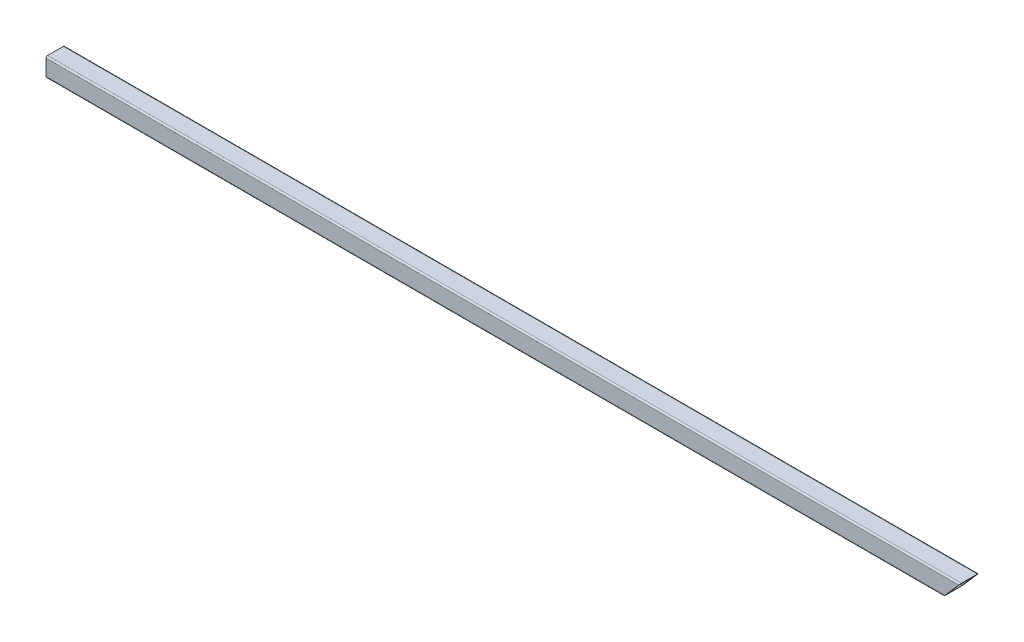
ISO-10303-21;
HEADER;
FILE_DESCRIPTION(('STEP AP214'),'2;1');
FILE_NAME('part.step','',(''),(''),'','','');
FILE_SCHEMA(('AUTOMOTIVE_DESIGN { 1 0 10303 214 1 1 1 1 }'));
ENDSEC;
DATA;
#1=APPLICATION_CONTEXT('core data for automotive mechanical design processes');
#2=APPLICATION_PROTOCOL_DEFINITION('international standard','automotive_design',2000,#1);
#3=PRODUCT_CONTEXT('',#1,'mechanical');
#4=PRODUCT('Part','Part','',(#3));
#5=PRODUCT_RELATED_PRODUCT_CATEGORY('part','',(#4));
#6=PRODUCT_DEFINITION_FORMATION('','',#4);
#7=PRODUCT_DEFINITION_CONTEXT('part definition',#1,'design');
#8=PRODUCT_DEFINITION('design','',#6,#7);
#9=PRODUCT_DEFINITION_SHAPE('','',#8);
#10=(LENGTH_UNIT() NAMED_UNIT(*) SI_UNIT(.MILLI.,.METRE.));
#11=(NAMED_UNIT(*) PLANE_ANGLE_UNIT() SI_UNIT($,.RADIAN.));
#12=(NAMED_UNIT(*) SI_UNIT($,.STERADIAN.) SOLID_ANGLE_UNIT());
#13=UNCERTAINTY_MEASURE_WITH_UNIT(LENGTH_MEASURE(1.E-05),#10,'distance_accuracy_value','');
#14=(GEOMETRIC_REPRESENTATION_CONTEXT(3) GLOBAL_UNCERTAINTY_ASSIGNED_CONTEXT((#13)) GLOBAL_UNIT_ASSIGNED_CONTEXT((#10,
#11,#12)) REPRESENTATION_CONTEXT('',''));
#15=CARTESIAN_POINT('',(0.,0.,0.));
#16=DIRECTION('',(0.,0.,1.));
#17=DIRECTION('',(1.,0.,0.));
#18=AXIS2_PLACEMENT_3D('',#15,#16,#17);
#19=CARTESIAN_POINT('',(1320.8,21.209,22.225));
#20=DIRECTION('',(0.,0.,-1.));
#21=DIRECTION('',(0.,1.,0.));
#22=AXIS2_PLACEMENT_3D('',#19,#20,#21);
#23=PLANE('',#22);
#24=DIRECTION('',(-1.,0.,0.));
#25=VECTOR('',#24,1.);
#26=CARTESIAN_POINT('',(1320.8,10.541,22.225));
#27=LINE('',#26,#25);
#28=CARTESIAN_POINT('',(606.359550915697,10.5410000000001,22.225));
#29=VERTEX_POINT('',#28);
#30=CARTESIAN_POINT('',(0.,10.541,22.225));
#31=VERTEX_POINT('',#30);
#32=EDGE_CURVE('E142',#29,#31,#27,.T.);
#33=ORIENTED_EDGE('',*,*,#32,.F.);
#34=DIRECTION('',(-0.65588614843026,-0.754859828244502,0.));
#35=VECTOR('',#34,1.);
#36=CARTESIAN_POINT('',(616.511599642519,22.225,22.225));
#37=LINE('',#36,#35);
#38=CARTESIAN_POINT('',(615.628812796709,21.2089999999999,22.225));
#39=VERTEX_POINT('',#38);
#40=EDGE_CURVE('E128',#39,#29,#37,.T.);
#41=ORIENTED_EDGE('',*,*,#40,.F.);
#42=DIRECTION('',(-1.,0.,0.));
#43=VECTOR('',#42,1.);
#44=CARTESIAN_POINT('',(1320.8,21.209,22.225));
#45=LINE('',#44,#43);
#46=CARTESIAN_POINT('',(0.,21.209,22.225));
#47=VERTEX_POINT('',#46);
#48=EDGE_CURVE('E150',#39,#47,#45,.T.);
#49=ORIENTED_EDGE('',*,*,#48,.T.);
#50=DIRECTION('',(0.,-1.,0.));
#51=VECTOR('',#50,1.);
#52=CARTESIAN_POINT('',(0.,21.209,22.225));
#53=LINE('',#52,#51);
#54=EDGE_CURVE('E148',#47,#31,#53,.T.);
#55=ORIENTED_EDGE('',*,*,#54,.T.);
#56=EDGE_LOOP('',(#33,#41,#49,#55));
#57=FACE_BOUND('',#56,.T.);
#58=ADVANCED_FACE('F43',(#57),#23,.F.);
#59=CARTESIAN_POINT('',(1320.8,21.209,21.209));
#60=DIRECTION('',(-1.,0.,0.));
#61=DIRECTION('',(0.,0.,1.));
#62=AXIS2_PLACEMENT_3D('',#59,#60,#61);
#63=CYLINDRICAL_SURFACE('',#62,1.016);
#64=ORIENTED_EDGE('',*,*,#48,.F.);
#65=CARTESIAN_POINT('',(615.628812796709,21.209,21.209));
#66=DIRECTION('',(-0.754859828244502,0.655886148430259,0.));
#67=DIRECTION('',(-0.655886148430259,-0.754859828244502,0.));
#68=AXIS2_PLACEMENT_3D('',#65,#66,#67);
#69=ELLIPSE('',#68,1.34594524968007,1.016);
#70=CARTESIAN_POINT('',(616.51159964252,22.225,21.209));
#71=VERTEX_POINT('',#70);
#72=EDGE_CURVE('E58',#39,#71,#69,.T.);
#73=ORIENTED_EDGE('',*,*,#72,.T.);
#74=DIRECTION('',(-1.,0.,0.));
#75=VECTOR('',#74,1.);
#76=CARTESIAN_POINT('',(1320.8,22.225,21.209));
#77=LINE('',#76,#75);
#78=CARTESIAN_POINT('',(0.,22.225,21.209));
#79=VERTEX_POINT('',#78);
#80=EDGE_CURVE('E152',#71,#79,#77,.T.);
#81=ORIENTED_EDGE('',*,*,#80,.T.);
#82=CARTESIAN_POINT('',(0.,21.209,21.209));
#83=DIRECTION('',(1.,0.,0.));
#84=DIRECTION('',(0.,0.,-1.));
#85=AXIS2_PLACEMENT_3D('',#82,#83,#84);
#86=CIRCLE('',#85,1.016);
#87=EDGE_CURVE('E154',#79,#47,#86,.T.);
#88=ORIENTED_EDGE('',*,*,#87,.T.);
#89=EDGE_LOOP('',(#64,#73,#81,#88));
#90=FACE_BOUND('',#89,.T.);
#91=ADVANCED_FACE('F261',(#90),#63,.T.);
#92=CARTESIAN_POINT('',(1320.8,22.225,10.541));
#93=DIRECTION('',(0.,-1.,0.));
#94=DIRECTION('',(0.,0.,-1.));
#95=AXIS2_PLACEMENT_3D('',#92,#93,#94);
#96=PLANE('',#95);
#97=ORIENTED_EDGE('',*,*,#80,.F.);
#98=DIRECTION('',(0.,0.,1.));
#99=VECTOR('',#98,1.);
#100=CARTESIAN_POINT('',(616.511599642519,22.225,9.525));
#101=LINE('',#100,#99);
#102=CARTESIAN_POINT('',(616.511599642519,22.225,10.541));
#103=VERTEX_POINT('',#102);
#104=EDGE_CURVE('E241',#103,#71,#101,.T.);
#105=ORIENTED_EDGE('',*,*,#104,.F.);
#106=DIRECTION('',(-1.,0.,0.));
#107=VECTOR('',#106,1.);
#108=CARTESIAN_POINT('',(1320.8,22.225,10.541));
#109=LINE('',#108,#107);
#110=CARTESIAN_POINT('',(0.,22.225,10.541));
#111=VERTEX_POINT('',#110);
#112=EDGE_CURVE('E195',#103,#111,#109,.T.);
#113=ORIENTED_EDGE('',*,*,#112,.T.);
#114=DIRECTION('',(0.,0.,1.));
#115=VECTOR('',#114,1.);
#116=CARTESIAN_POINT('',(0.,22.225,10.541));
#117=LINE('',#116,#115);
#118=EDGE_CURVE('E161',#111,#79,#117,.T.);
#119=ORIENTED_EDGE('',*,*,#118,.T.);
#120=EDGE_LOOP('',(#97,#105,#113,#119));
#121=FACE_BOUND('',#120,.T.);
#122=ADVANCED_FACE('F259',(#121),#96,.F.);
#123=CARTESIAN_POINT('',(1320.8,21.209,10.541));
#124=DIRECTION('',(-1.,0.,0.));
#125=DIRECTION('',(0.,0.,1.));
#126=AXIS2_PLACEMENT_3D('',#123,#124,#125);
#127=CYLINDRICAL_SURFACE('',#126,1.016);
#128=ORIENTED_EDGE('',*,*,#112,.F.);
#129=CARTESIAN_POINT('',(615.628812796709,21.209,10.541));
#130=DIRECTION('',(-0.754859828244502,0.655886148430259,0.));
#131=DIRECTION('',(-0.655886148430259,-0.754859828244502,0.));
#132=AXIS2_PLACEMENT_3D('',#129,#130,#131);
#133=ELLIPSE('',#132,1.34594524968007,1.016);
#134=CARTESIAN_POINT('',(615.628812796709,21.209,9.525));
#135=VERTEX_POINT('',#134);
#136=EDGE_CURVE('E229',#103,#135,#133,.T.);
#137=ORIENTED_EDGE('',*,*,#136,.T.);
#138=DIRECTION('',(-1.,0.,0.));
#139=VECTOR('',#138,1.);
#140=CARTESIAN_POINT('',(1320.8,21.209,9.525));
#141=LINE('',#140,#139);
#142=CARTESIAN_POINT('',(0.,21.209,9.525));
#143=VERTEX_POINT('',#142);
#144=EDGE_CURVE('E193',#135,#143,#141,.T.);
#145=ORIENTED_EDGE('',*,*,#144,.T.);
#146=CARTESIAN_POINT('',(0.,21.209,10.541));
#147=DIRECTION('',(1.,0.,0.));
#148=DIRECTION('',(0.,0.,-1.));
#149=AXIS2_PLACEMENT_3D('',#146,#147,#148);
#150=CIRCLE('',#149,1.016);
#151=EDGE_CURVE('E164',#143,#111,#150,.T.);
#152=ORIENTED_EDGE('',*,*,#151,.T.);
#153=EDGE_LOOP('',(#128,#137,#145,#152));
#154=FACE_BOUND('',#153,.T.);
#155=ADVANCED_FACE('F255',(#154),#127,.T.);
#156=CARTESIAN_POINT('',(1320.8,10.541,9.525));
#157=DIRECTION('',(0.,0.,1.));
#158=DIRECTION('',(1.,0.,0.));
#159=AXIS2_PLACEMENT_3D('',#156,#157,#158);
#160=PLANE('',#159);
#161=ORIENTED_EDGE('',*,*,#144,.F.);
#162=DIRECTION('',(-0.65588614843026,-0.754859828244502,0.));
#163=VECTOR('',#162,1.);
#164=CARTESIAN_POINT('',(616.511599642519,22.225,9.525));
#165=LINE('',#164,#163);
#166=CARTESIAN_POINT('',(606.359550915697,10.541,9.525));
#167=VERTEX_POINT('',#166);
#168=EDGE_CURVE('E136',#135,#167,#165,.T.);
#169=ORIENTED_EDGE('',*,*,#168,.T.);
#170=DIRECTION('',(-1.,0.,0.));
#171=VECTOR('',#170,1.);
#172=CARTESIAN_POINT('',(1320.8,10.541,9.525));
#173=LINE('',#172,#171);
#174=CARTESIAN_POINT('',(0.,10.541,9.525));
#175=VERTEX_POINT('',#174);
#176=EDGE_CURVE('E191',#167,#175,#173,.T.);
#177=ORIENTED_EDGE('',*,*,#176,.T.);
#178=DIRECTION('',(0.,1.,0.));
#179=VECTOR('',#178,1.);
#180=CARTESIAN_POINT('',(0.,10.541,9.525));
#181=LINE('',#180,#179);
#182=EDGE_CURVE('E167',#175,#143,#181,.T.);
#183=ORIENTED_EDGE('',*,*,#182,.T.);
#184=EDGE_LOOP('',(#161,#169,#177,#183));
#185=FACE_BOUND('',#184,.T.);
#186=ADVANCED_FACE('F248',(#185),#160,.F.);
#187=CARTESIAN_POINT('',(1320.8,10.541,10.541));
#188=DIRECTION('',(-1.,0.,0.));
#189=DIRECTION('',(0.,0.,1.));
#190=AXIS2_PLACEMENT_3D('',#187,#188,#189);
#191=CYLINDRICAL_SURFACE('',#190,1.016);
#192=ORIENTED_EDGE('',*,*,#176,.F.);
#193=CARTESIAN_POINT('',(606.359550915697,10.541,10.541));
#194=DIRECTION('',(-0.754859828244502,0.655886148430259,0.));
#195=DIRECTION('',(-0.655886148430259,-0.754859828244502,0.));
#196=AXIS2_PLACEMENT_3D('',#193,#194,#195);
#197=ELLIPSE('',#196,1.34594524968007,1.016);
#198=CARTESIAN_POINT('',(605.476764069886,9.525,10.541));
#199=VERTEX_POINT('',#198);
#200=EDGE_CURVE('E145',#167,#199,#197,.T.);
#201=ORIENTED_EDGE('',*,*,#200,.T.);
#202=DIRECTION('',(-1.,0.,0.));
#203=VECTOR('',#202,1.);
#204=CARTESIAN_POINT('',(1320.8,9.525,10.541));
#205=LINE('',#204,#203);
#206=CARTESIAN_POINT('',(0.,9.525,10.541));
#207=VERTEX_POINT('',#206);
#208=EDGE_CURVE('E189',#199,#207,#205,.T.);
#209=ORIENTED_EDGE('',*,*,#208,.T.);
#210=CARTESIAN_POINT('',(0.,10.541,10.541));
#211=DIRECTION('',(1.,0.,0.));
#212=DIRECTION('',(0.,0.,-1.));
#213=AXIS2_PLACEMENT_3D('',#210,#211,#212);
#214=CIRCLE('',#213,1.016);
#215=EDGE_CURVE('E170',#207,#175,#214,.T.);
#216=ORIENTED_EDGE('',*,*,#215,.T.);
#217=EDGE_LOOP('',(#192,#201,#209,#216));
#218=FACE_BOUND('',#217,.T.);
#219=ADVANCED_FACE('F250',(#218),#191,.T.);
#220=CARTESIAN_POINT('',(1320.8,9.525,21.209));
#221=DIRECTION('',(0.,1.,0.));
#222=DIRECTION('',(0.,0.,1.));
#223=AXIS2_PLACEMENT_3D('',#220,#221,#222);
#224=PLANE('',#223);
#225=ORIENTED_EDGE('',*,*,#208,.F.);
#226=DIRECTION('',(0.,0.,1.));
#227=VECTOR('',#226,1.);
#228=CARTESIAN_POINT('',(605.476764069886,9.525,9.525));
#229=LINE('',#228,#227);
#230=CARTESIAN_POINT('',(605.476764069886,9.525,21.209));
#231=VERTEX_POINT('',#230);
#232=EDGE_CURVE('E224',#199,#231,#229,.T.);
#233=ORIENTED_EDGE('',*,*,#232,.T.);
#234=DIRECTION('',(-1.,0.,0.));
#235=VECTOR('',#234,1.);
#236=CARTESIAN_POINT('',(1320.8,9.525,21.209));
#237=LINE('',#236,#235);
#238=CARTESIAN_POINT('',(0.,9.525,21.209));
#239=VERTEX_POINT('',#238);
#240=EDGE_CURVE('E51',#231,#239,#237,.T.);
#241=ORIENTED_EDGE('',*,*,#240,.T.);
#242=DIRECTION('',(0.,0.,-1.));
#243=VECTOR('',#242,1.);
#244=CARTESIAN_POINT('',(0.,9.525,21.209));
#245=LINE('',#244,#243);
#246=EDGE_CURVE('E173',#239,#207,#245,.T.);
#247=ORIENTED_EDGE('',*,*,#246,.T.);
#248=EDGE_LOOP('',(#225,#233,#241,#247));
#249=FACE_BOUND('',#248,.T.);
#250=ADVANCED_FACE('F240',(#249),#224,.F.);
#251=CARTESIAN_POINT('',(1320.8,10.541,21.209));
#252=DIRECTION('',(-1.,0.,0.));
#253=DIRECTION('',(0.,0.,1.));
#254=AXIS2_PLACEMENT_3D('',#251,#252,#253);
#255=CYLINDRICAL_SURFACE('',#254,1.016);
#256=ORIENTED_EDGE('',*,*,#240,.F.);
#257=CARTESIAN_POINT('',(606.359550915697,10.541,21.209));
#258=DIRECTION('',(-0.754859828244502,0.655886148430259,0.));
#259=DIRECTION('',(-0.655886148430259,-0.754859828244502,0.));
#260=AXIS2_PLACEMENT_3D('',#257,#258,#259);
#261=ELLIPSE('',#260,1.34594524968007,1.016);
#262=EDGE_CURVE('E131',#231,#29,#261,.T.);
#263=ORIENTED_EDGE('',*,*,#262,.T.);
#264=ORIENTED_EDGE('',*,*,#32,.T.);
#265=CARTESIAN_POINT('',(0.,10.541,21.209));
#266=DIRECTION('',(1.,0.,0.));
#267=DIRECTION('',(0.,0.,-1.));
#268=AXIS2_PLACEMENT_3D('',#265,#266,#267);
#269=CIRCLE('',#268,1.01599999999999);
#270=EDGE_CURVE('E176',#31,#239,#269,.T.);
#271=ORIENTED_EDGE('',*,*,#270,.T.);
#272=EDGE_LOOP('',(#256,#263,#264,#271));
#273=FACE_BOUND('',#272,.T.);
#274=ADVANCED_FACE('F140',(#273),#255,.T.);
#275=CARTESIAN_POINT('',(0.,10.541,21.209));
#276=DIRECTION('',(1.,0.,0.));
#277=DIRECTION('',(0.,0.,-1.));
#278=AXIS2_PLACEMENT_3D('',#275,#276,#277);
#279=PLANE('',#278);
#280=ORIENTED_EDGE('',*,*,#270,.F.);
#281=ORIENTED_EDGE('',*,*,#54,.F.);
#282=ORIENTED_EDGE('',*,*,#87,.F.);
#283=ORIENTED_EDGE('',*,*,#118,.F.);
#284=ORIENTED_EDGE('',*,*,#151,.F.);
#285=ORIENTED_EDGE('',*,*,#182,.F.);
#286=ORIENTED_EDGE('',*,*,#215,.F.);
#287=ORIENTED_EDGE('',*,*,#246,.F.);
#288=EDGE_LOOP('',(#280,#281,#282,#283,#284,#285,#286,#287));
#289=FACE_BOUND('',#288,.T.);
#290=DIRECTION('',(0.,0.,-1.));
#291=VECTOR('',#290,1.);
#292=CARTESIAN_POINT('',(0.,11.176,20.574));
#293=LINE('',#292,#291);
#294=CARTESIAN_POINT('',(0.,11.176,20.574));
#295=VERTEX_POINT('',#294);
#296=CARTESIAN_POINT('',(0.,11.176,11.176));
#297=VERTEX_POINT('',#296);
#298=EDGE_CURVE('E144',#295,#297,#293,.T.);
#299=ORIENTED_EDGE('',*,*,#298,.T.);
#300=DIRECTION('',(0.,1.,0.));
#301=VECTOR('',#300,1.);
#302=CARTESIAN_POINT('',(0.,11.176,11.176));
#303=LINE('',#302,#301);
#304=CARTESIAN_POINT('',(0.,20.574,11.176));
#305=VERTEX_POINT('',#304);
#306=EDGE_CURVE('E179',#297,#305,#303,.T.);
#307=ORIENTED_EDGE('',*,*,#306,.T.);
#308=DIRECTION('',(0.,0.,1.));
#309=VECTOR('',#308,1.);
#310=CARTESIAN_POINT('',(0.,20.574,11.176));
#311=LINE('',#310,#309);
#312=CARTESIAN_POINT('',(0.,20.574,20.574));
#313=VERTEX_POINT('',#312);
#314=EDGE_CURVE('E182',#305,#313,#311,.T.);
#315=ORIENTED_EDGE('',*,*,#314,.T.);
#316=DIRECTION('',(0.,-1.,0.));
#317=VECTOR('',#316,1.);
#318=CARTESIAN_POINT('',(0.,20.574,20.574));
#319=LINE('',#318,#317);
#320=EDGE_CURVE('E185',#313,#295,#319,.T.);
#321=ORIENTED_EDGE('',*,*,#320,.T.);
#322=EDGE_LOOP('',(#299,#307,#315,#321));
#323=FACE_BOUND('',#322,.T.);
#324=ADVANCED_FACE('F215',(#289,#323),#279,.F.);
#325=CARTESIAN_POINT('',(1320.8,20.574,20.574));
#326=DIRECTION('',(0.,0.,-1.));
#327=DIRECTION('',(0.,1.,0.));
#328=AXIS2_PLACEMENT_3D('',#325,#326,#327);
#329=PLANE('',#328);
#330=DIRECTION('',(0.655886148430259,0.754859828244502,0.));
#331=VECTOR('',#330,1.);
#332=CARTESIAN_POINT('',(918.669646397944,369.97890793414,20.5740000000001));
#333=LINE('',#332,#331);
#334=CARTESIAN_POINT('',(606.911292694328,11.176,20.574));
#335=VERTEX_POINT('',#334);
#336=CARTESIAN_POINT('',(615.077071018077,20.574,20.574));
#337=VERTEX_POINT('',#336);
#338=EDGE_CURVE('E11',#335,#337,#333,.T.);
#339=ORIENTED_EDGE('',*,*,#338,.F.);
#340=DIRECTION('',(-1.,0.,0.));
#341=VECTOR('',#340,1.);
#342=CARTESIAN_POINT('',(1320.8,11.176,20.574));
#343=LINE('',#342,#341);
#344=EDGE_CURVE('E188',#335,#295,#343,.T.);
#345=ORIENTED_EDGE('',*,*,#344,.T.);
#346=ORIENTED_EDGE('',*,*,#320,.F.);
#347=DIRECTION('',(-1.,0.,0.));
#348=VECTOR('',#347,1.);
#349=CARTESIAN_POINT('',(1320.8,20.574,20.574));
#350=LINE('',#349,#348);
#351=EDGE_CURVE('E199',#337,#313,#350,.T.);
#352=ORIENTED_EDGE('',*,*,#351,.F.);
#353=EDGE_LOOP('',(#339,#345,#346,#352));
#354=FACE_BOUND('',#353,.T.);
#355=ADVANCED_FACE('F45',(#354),#329,.T.);
#356=CARTESIAN_POINT('',(1320.8,20.574,11.176));
#357=DIRECTION('',(0.,-1.,0.));
#358=DIRECTION('',(0.,0.,-1.));
#359=AXIS2_PLACEMENT_3D('',#356,#357,#358);
#360=PLANE('',#359);
#361=DIRECTION('',(0.,0.,-1.));
#362=VECTOR('',#361,1.);
#363=CARTESIAN_POINT('',(615.077071018077,20.574,11.1759999999999));
#364=LINE('',#363,#362);
#365=CARTESIAN_POINT('',(615.077071018077,20.574,11.176));
#366=VERTEX_POINT('',#365);
#367=EDGE_CURVE('E210',#337,#366,#364,.T.);
#368=ORIENTED_EDGE('',*,*,#367,.F.);
#369=ORIENTED_EDGE('',*,*,#351,.T.);
#370=ORIENTED_EDGE('',*,*,#314,.F.);
#371=DIRECTION('',(-1.,0.,0.));
#372=VECTOR('',#371,1.);
#373=CARTESIAN_POINT('',(1320.8,20.574,11.176));
#374=LINE('',#373,#372);
#375=EDGE_CURVE('E202',#366,#305,#374,.T.);
#376=ORIENTED_EDGE('',*,*,#375,.F.);
#377=EDGE_LOOP('',(#368,#369,#370,#376));
#378=FACE_BOUND('',#377,.T.);
#379=ADVANCED_FACE('F208',(#378),#360,.T.);
#380=CARTESIAN_POINT('',(1320.8,11.176,11.176));
#381=DIRECTION('',(0.,0.,1.));
#382=DIRECTION('',(1.,0.,0.));
#383=AXIS2_PLACEMENT_3D('',#380,#381,#382);
#384=PLANE('',#383);
#385=DIRECTION('',(-0.655886148430259,-0.754859828244502,0.));
#386=VECTOR('',#385,1.);
#387=CARTESIAN_POINT('',(914.016676811846,364.623801974065,11.176));
#388=LINE('',#387,#386);
#389=CARTESIAN_POINT('',(606.911292694328,11.176,11.176));
#390=VERTEX_POINT('',#389);
#391=EDGE_CURVE('E221',#366,#390,#388,.T.);
#392=ORIENTED_EDGE('',*,*,#391,.F.);
#393=ORIENTED_EDGE('',*,*,#375,.T.);
#394=ORIENTED_EDGE('',*,*,#306,.F.);
#395=DIRECTION('',(-1.,0.,0.));
#396=VECTOR('',#395,1.);
#397=CARTESIAN_POINT('',(1320.8,11.176,11.176));
#398=LINE('',#397,#396);
#399=EDGE_CURVE('E200',#390,#297,#398,.T.);
#400=ORIENTED_EDGE('',*,*,#399,.F.);
#401=EDGE_LOOP('',(#392,#393,#394,#400));
#402=FACE_BOUND('',#401,.T.);
#403=ADVANCED_FACE('F220',(#402),#384,.T.);
#404=CARTESIAN_POINT('',(1320.8,11.176,20.574));
#405=DIRECTION('',(0.,1.,0.));
#406=DIRECTION('',(0.,0.,1.));
#407=AXIS2_PLACEMENT_3D('',#404,#405,#406);
#408=PLANE('',#407);
#409=DIRECTION('',(0.,0.,1.));
#410=VECTOR('',#409,1.);
#411=CARTESIAN_POINT('',(606.911292694328,11.176,20.574));
#412=LINE('',#411,#410);
#413=EDGE_CURVE('E65',#390,#335,#412,.T.);
#414=ORIENTED_EDGE('',*,*,#413,.F.);
#415=ORIENTED_EDGE('',*,*,#399,.T.);
#416=ORIENTED_EDGE('',*,*,#298,.F.);
#417=ORIENTED_EDGE('',*,*,#344,.F.);
#418=EDGE_LOOP('',(#414,#415,#416,#417));
#419=FACE_BOUND('',#418,.T.);
#420=ADVANCED_FACE('F272',(#419),#408,.T.);
#421=CARTESIAN_POINT('',(616.511599642519,22.225,9.525));
#422=DIRECTION('',(-0.754859828244502,0.655886148430259,0.));
#423=DIRECTION('',(-0.655886148430259,-0.754859828244502,0.));
#424=AXIS2_PLACEMENT_3D('',#421,#422,#423);
#425=PLANE('',#424);
#426=ORIENTED_EDGE('',*,*,#413,.T.);
#427=ORIENTED_EDGE('',*,*,#338,.T.);
#428=ORIENTED_EDGE('',*,*,#367,.T.);
#429=ORIENTED_EDGE('',*,*,#391,.T.);
#430=EDGE_LOOP('',(#426,#427,#428,#429));
#431=FACE_BOUND('',#430,.T.);
#432=ORIENTED_EDGE('',*,*,#232,.F.);
#433=ORIENTED_EDGE('',*,*,#200,.F.);
#434=ORIENTED_EDGE('',*,*,#168,.F.);
#435=ORIENTED_EDGE('',*,*,#136,.F.);
#436=ORIENTED_EDGE('',*,*,#104,.T.);
#437=ORIENTED_EDGE('',*,*,#72,.F.);
#438=ORIENTED_EDGE('',*,*,#40,.T.);
#439=ORIENTED_EDGE('',*,*,#262,.F.);
#440=EDGE_LOOP('',(#432,#433,#434,#435,#436,#437,#438,#439));
#441=FACE_BOUND('',#440,.T.);
#442=ADVANCED_FACE('F130',(#431,#441),#425,.F.);
#443=CLOSED_SHELL('',(#58,#91,#122,#155,#186,#219,#250,#274,#324,#355,#379,#403,#420,#442));
#444=MANIFOLD_SOLID_BREP('B2',#443);
#445=ADVANCED_BREP_SHAPE_REPRESENTATION('',(#18,#444),#14);
#446=SHAPE_DEFINITION_REPRESENTATION(#9,#445);
ENDSEC;
END-ISO-10303-21;
